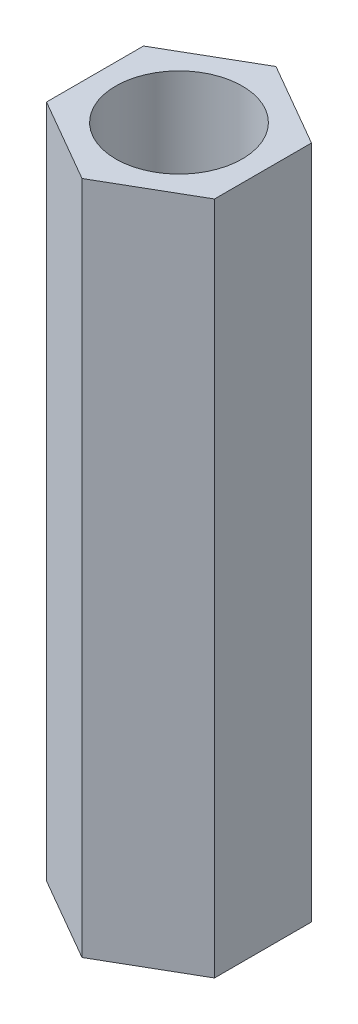
ISO-10303-21;
HEADER;
FILE_DESCRIPTION(('STEP AP214'),'2;1');
FILE_NAME('part.step','',(''),(''),'','','');
FILE_SCHEMA(('AUTOMOTIVE_DESIGN { 1 0 10303 214 1 1 1 1 }'));
ENDSEC;
DATA;
#1=APPLICATION_CONTEXT('core data for automotive mechanical design processes');
#2=APPLICATION_PROTOCOL_DEFINITION('international standard','automotive_design',2000,#1);
#3=PRODUCT_CONTEXT('',#1,'mechanical');
#4=PRODUCT('Part','Part','',(#3));
#5=PRODUCT_RELATED_PRODUCT_CATEGORY('part','',(#4));
#6=PRODUCT_DEFINITION_FORMATION('','',#4);
#7=PRODUCT_DEFINITION_CONTEXT('part definition',#1,'design');
#8=PRODUCT_DEFINITION('design','',#6,#7);
#9=PRODUCT_DEFINITION_SHAPE('','',#8);
#10=(LENGTH_UNIT() NAMED_UNIT(*) SI_UNIT(.MILLI.,.METRE.));
#11=(NAMED_UNIT(*) PLANE_ANGLE_UNIT() SI_UNIT($,.RADIAN.));
#12=(NAMED_UNIT(*) SI_UNIT($,.STERADIAN.) SOLID_ANGLE_UNIT());
#13=UNCERTAINTY_MEASURE_WITH_UNIT(LENGTH_MEASURE(1.E-05),#10,'distance_accuracy_value','');
#14=(GEOMETRIC_REPRESENTATION_CONTEXT(3) GLOBAL_UNCERTAINTY_ASSIGNED_CONTEXT((#13)) GLOBAL_UNIT_ASSIGNED_CONTEXT((#10,
#11,#12)) REPRESENTATION_CONTEXT('',''));
#15=CARTESIAN_POINT('',(0.,0.,0.));
#16=DIRECTION('',(0.,0.,1.));
#17=DIRECTION('',(1.,0.,0.));
#18=AXIS2_PLACEMENT_3D('',#15,#16,#17);
#19=CARTESIAN_POINT('',(0.,16.,0.));
#20=DIRECTION('',(0.,1.,0.));
#21=DIRECTION('',(0.,0.,1.));
#22=AXIS2_PLACEMENT_3D('',#19,#20,#21);
#23=PLANE('',#22);
#24=DIRECTION('',(0.,0.,-1.));
#25=VECTOR('',#24,1.);
#26=CARTESIAN_POINT('',(1.99185842870421,16.,1.14999999999999));
#27=LINE('',#26,#25);
#28=CARTESIAN_POINT('',(1.99185842870421,16.,1.14999999999999));
#29=VERTEX_POINT('',#28);
#30=CARTESIAN_POINT('',(1.9918584287042,16.,-1.15000000000001));
#31=VERTEX_POINT('',#30);
#32=EDGE_CURVE('E137',#29,#31,#27,.T.);
#33=ORIENTED_EDGE('',*,*,#32,.T.);
#34=DIRECTION('',(-0.866025403784441,0.,-0.499999999999995));
#35=VECTOR('',#34,1.);
#36=CARTESIAN_POINT('',(1.9918584287042,16.,-1.15000000000001));
#37=LINE('',#36,#35);
#38=CARTESIAN_POINT('',(0.,16.,-2.3));
#39=VERTEX_POINT('',#38);
#40=EDGE_CURVE('E95',#31,#39,#37,.T.);
#41=ORIENTED_EDGE('',*,*,#40,.T.);
#42=DIRECTION('',(-0.866025403784436,0.,0.500000000000004));
#43=VECTOR('',#42,1.);
#44=CARTESIAN_POINT('',(0.,16.,-2.3));
#45=LINE('',#44,#43);
#46=CARTESIAN_POINT('',(-1.99185842870422,16.,-1.14999999999999));
#47=VERTEX_POINT('',#46);
#48=EDGE_CURVE('E108',#39,#47,#45,.T.);
#49=ORIENTED_EDGE('',*,*,#48,.T.);
#50=DIRECTION('',(0.,0.,1.));
#51=VECTOR('',#50,1.);
#52=CARTESIAN_POINT('',(-1.99185842870422,16.,-1.14999999999999));
#53=LINE('',#52,#51);
#54=CARTESIAN_POINT('',(-1.9918584287042,16.,1.15000000000001));
#55=VERTEX_POINT('',#54);
#56=EDGE_CURVE('E102',#47,#55,#53,.T.);
#57=ORIENTED_EDGE('',*,*,#56,.T.);
#58=DIRECTION('',(0.866025403784441,0.,0.499999999999995));
#59=VECTOR('',#58,1.);
#60=CARTESIAN_POINT('',(-1.9918584287042,16.,1.15000000000001));
#61=LINE('',#60,#59);
#62=CARTESIAN_POINT('',(0.,16.,2.3));
#63=VERTEX_POINT('',#62);
#64=EDGE_CURVE('E106',#55,#63,#61,.T.);
#65=ORIENTED_EDGE('',*,*,#64,.T.);
#66=DIRECTION('',(0.866025403784436,0.,-0.500000000000004));
#67=VECTOR('',#66,1.);
#68=CARTESIAN_POINT('',(0.,16.,2.3));
#69=LINE('',#68,#67);
#70=EDGE_CURVE('E58',#63,#29,#69,.T.);
#71=ORIENTED_EDGE('',*,*,#70,.T.);
#72=EDGE_LOOP('',(#33,#41,#49,#57,#65,#71));
#73=FACE_BOUND('',#72,.T.);
#74=CARTESIAN_POINT('',(0.,16.,0.));
#75=DIRECTION('',(0.,1.,0.));
#76=DIRECTION('',(0.,0.,1.));
#77=AXIS2_PLACEMENT_3D('',#74,#75,#76);
#78=CIRCLE('',#77,1.5);
#79=CARTESIAN_POINT('',(0.,16.,1.5));
#80=VERTEX_POINT('',#79);
#81=EDGE_CURVE('E130',#80,#80,#78,.T.);
#82=ORIENTED_EDGE('',*,*,#81,.F.);
#83=EDGE_LOOP('',(#82));
#84=FACE_BOUND('',#83,.T.);
#85=ADVANCED_FACE('F41',(#73,#84),#23,.T.);
#86=CARTESIAN_POINT('',(0.,0.,0.));
#87=DIRECTION('',(0.,1.,0.));
#88=DIRECTION('',(0.,0.,1.));
#89=AXIS2_PLACEMENT_3D('',#86,#87,#88);
#90=PLANE('',#89);
#91=DIRECTION('',(0.,0.,-1.));
#92=VECTOR('',#91,1.);
#93=CARTESIAN_POINT('',(1.99185842870421,0.,1.14999999999999));
#94=LINE('',#93,#92);
#95=CARTESIAN_POINT('',(1.99185842870421,0.,1.14999999999999));
#96=VERTEX_POINT('',#95);
#97=CARTESIAN_POINT('',(1.9918584287042,0.,-1.15000000000001));
#98=VERTEX_POINT('',#97);
#99=EDGE_CURVE('E126',#96,#98,#94,.T.);
#100=ORIENTED_EDGE('',*,*,#99,.F.);
#101=DIRECTION('',(0.866025403784436,0.,-0.500000000000004));
#102=VECTOR('',#101,1.);
#103=CARTESIAN_POINT('',(0.,0.,2.3));
#104=LINE('',#103,#102);
#105=CARTESIAN_POINT('',(0.,0.,2.3));
#106=VERTEX_POINT('',#105);
#107=EDGE_CURVE('E87',#106,#96,#104,.T.);
#108=ORIENTED_EDGE('',*,*,#107,.F.);
#109=DIRECTION('',(0.866025403784441,0.,0.499999999999995));
#110=VECTOR('',#109,1.);
#111=CARTESIAN_POINT('',(-1.9918584287042,0.,1.15000000000001));
#112=LINE('',#111,#110);
#113=CARTESIAN_POINT('',(-1.9918584287042,0.,1.15000000000001));
#114=VERTEX_POINT('',#113);
#115=EDGE_CURVE('E81',#114,#106,#112,.T.);
#116=ORIENTED_EDGE('',*,*,#115,.F.);
#117=DIRECTION('',(0.,0.,1.));
#118=VECTOR('',#117,1.);
#119=CARTESIAN_POINT('',(-1.99185842870422,0.,-1.14999999999999));
#120=LINE('',#119,#118);
#121=CARTESIAN_POINT('',(-1.99185842870422,0.,-1.14999999999999));
#122=VERTEX_POINT('',#121);
#123=EDGE_CURVE('E116',#122,#114,#120,.T.);
#124=ORIENTED_EDGE('',*,*,#123,.F.);
#125=DIRECTION('',(-0.866025403784436,0.,0.500000000000004));
#126=VECTOR('',#125,1.);
#127=CARTESIAN_POINT('',(0.,0.,-2.3));
#128=LINE('',#127,#126);
#129=CARTESIAN_POINT('',(0.,0.,-2.3));
#130=VERTEX_POINT('',#129);
#131=EDGE_CURVE('E132',#130,#122,#128,.T.);
#132=ORIENTED_EDGE('',*,*,#131,.F.);
#133=DIRECTION('',(-0.866025403784441,0.,-0.499999999999995));
#134=VECTOR('',#133,1.);
#135=CARTESIAN_POINT('',(1.9918584287042,0.,-1.15000000000001));
#136=LINE('',#135,#134);
#137=EDGE_CURVE('E129',#98,#130,#136,.T.);
#138=ORIENTED_EDGE('',*,*,#137,.F.);
#139=EDGE_LOOP('',(#100,#108,#116,#124,#132,#138));
#140=FACE_BOUND('',#139,.T.);
#141=CARTESIAN_POINT('',(0.,0.,0.));
#142=DIRECTION('',(0.,1.,0.));
#143=DIRECTION('',(0.,0.,1.));
#144=AXIS2_PLACEMENT_3D('',#141,#142,#143);
#145=CIRCLE('',#144,1.5);
#146=CARTESIAN_POINT('',(0.,0.,1.5));
#147=VERTEX_POINT('',#146);
#148=EDGE_CURVE('E230',#147,#147,#145,.T.);
#149=ORIENTED_EDGE('',*,*,#148,.T.);
#150=EDGE_LOOP('',(#149));
#151=FACE_BOUND('',#150,.T.);
#152=ADVANCED_FACE('F146',(#140,#151),#90,.F.);
#153=CARTESIAN_POINT('',(1.99185842870421,16.,1.14999999999999));
#154=DIRECTION('',(-1.,0.,0.));
#155=DIRECTION('',(0.,0.,1.));
#156=AXIS2_PLACEMENT_3D('',#153,#154,#155);
#157=PLANE('',#156);
#158=ORIENTED_EDGE('',*,*,#99,.T.);
#159=DIRECTION('',(0.,-1.,0.));
#160=VECTOR('',#159,1.);
#161=CARTESIAN_POINT('',(1.9918584287042,16.,-1.15000000000001));
#162=LINE('',#161,#160);
#163=EDGE_CURVE('E11',#31,#98,#162,.T.);
#164=ORIENTED_EDGE('',*,*,#163,.F.);
#165=ORIENTED_EDGE('',*,*,#32,.F.);
#166=DIRECTION('',(0.,-1.,0.));
#167=VECTOR('',#166,1.);
#168=CARTESIAN_POINT('',(1.99185842870421,16.,1.14999999999999));
#169=LINE('',#168,#167);
#170=EDGE_CURVE('E122',#29,#96,#169,.T.);
#171=ORIENTED_EDGE('',*,*,#170,.T.);
#172=EDGE_LOOP('',(#158,#164,#165,#171));
#173=FACE_BOUND('',#172,.T.);
#174=ADVANCED_FACE('F43',(#173),#157,.F.);
#175=CARTESIAN_POINT('',(1.9918584287042,16.,-1.15000000000001));
#176=DIRECTION('',(-0.499999999999995,0.,0.866025403784441));
#177=DIRECTION('',(0.866025403784441,0.,0.499999999999995));
#178=AXIS2_PLACEMENT_3D('',#175,#176,#177);
#179=PLANE('',#178);
#180=ORIENTED_EDGE('',*,*,#137,.T.);
#181=DIRECTION('',(0.,-1.,0.));
#182=VECTOR('',#181,1.);
#183=CARTESIAN_POINT('',(0.,16.,-2.3));
#184=LINE('',#183,#182);
#185=EDGE_CURVE('E50',#39,#130,#184,.T.);
#186=ORIENTED_EDGE('',*,*,#185,.F.);
#187=ORIENTED_EDGE('',*,*,#40,.F.);
#188=ORIENTED_EDGE('',*,*,#163,.T.);
#189=EDGE_LOOP('',(#180,#186,#187,#188));
#190=FACE_BOUND('',#189,.T.);
#191=ADVANCED_FACE('F171',(#190),#179,.F.);
#192=CARTESIAN_POINT('',(0.,16.,-2.3));
#193=DIRECTION('',(0.500000000000004,0.,0.866025403784436));
#194=DIRECTION('',(0.866025403784436,0.,-0.500000000000004));
#195=AXIS2_PLACEMENT_3D('',#192,#193,#194);
#196=PLANE('',#195);
#197=ORIENTED_EDGE('',*,*,#131,.T.);
#198=DIRECTION('',(0.,-1.,0.));
#199=VECTOR('',#198,1.);
#200=CARTESIAN_POINT('',(-1.99185842870422,16.,-1.14999999999999));
#201=LINE('',#200,#199);
#202=EDGE_CURVE('E117',#47,#122,#201,.T.);
#203=ORIENTED_EDGE('',*,*,#202,.F.);
#204=ORIENTED_EDGE('',*,*,#48,.F.);
#205=ORIENTED_EDGE('',*,*,#185,.T.);
#206=EDGE_LOOP('',(#197,#203,#204,#205));
#207=FACE_BOUND('',#206,.T.);
#208=ADVANCED_FACE('F143',(#207),#196,.F.);
#209=CARTESIAN_POINT('',(-1.99185842870422,16.,-1.14999999999999));
#210=DIRECTION('',(1.,0.,0.));
#211=DIRECTION('',(0.,0.,-1.));
#212=AXIS2_PLACEMENT_3D('',#209,#210,#211);
#213=PLANE('',#212);
#214=ORIENTED_EDGE('',*,*,#123,.T.);
#215=DIRECTION('',(0.,-1.,0.));
#216=VECTOR('',#215,1.);
#217=CARTESIAN_POINT('',(-1.9918584287042,16.,1.15000000000001));
#218=LINE('',#217,#216);
#219=EDGE_CURVE('E113',#55,#114,#218,.T.);
#220=ORIENTED_EDGE('',*,*,#219,.F.);
#221=ORIENTED_EDGE('',*,*,#56,.F.);
#222=ORIENTED_EDGE('',*,*,#202,.T.);
#223=EDGE_LOOP('',(#214,#220,#221,#222));
#224=FACE_BOUND('',#223,.T.);
#225=ADVANCED_FACE('F114',(#224),#213,.F.);
#226=CARTESIAN_POINT('',(-1.9918584287042,16.,1.15000000000001));
#227=DIRECTION('',(0.499999999999995,0.,-0.866025403784441));
#228=DIRECTION('',(-0.866025403784441,0.,-0.499999999999995));
#229=AXIS2_PLACEMENT_3D('',#226,#227,#228);
#230=PLANE('',#229);
#231=ORIENTED_EDGE('',*,*,#115,.T.);
#232=DIRECTION('',(0.,-1.,0.));
#233=VECTOR('',#232,1.);
#234=CARTESIAN_POINT('',(0.,16.,2.3));
#235=LINE('',#234,#233);
#236=EDGE_CURVE('E118',#63,#106,#235,.T.);
#237=ORIENTED_EDGE('',*,*,#236,.F.);
#238=ORIENTED_EDGE('',*,*,#64,.F.);
#239=ORIENTED_EDGE('',*,*,#219,.T.);
#240=EDGE_LOOP('',(#231,#237,#238,#239));
#241=FACE_BOUND('',#240,.T.);
#242=ADVANCED_FACE('F120',(#241),#230,.F.);
#243=CARTESIAN_POINT('',(0.,16.,2.3));
#244=DIRECTION('',(-0.500000000000004,0.,-0.866025403784436));
#245=DIRECTION('',(-0.866025403784437,0.,0.500000000000004));
#246=AXIS2_PLACEMENT_3D('',#243,#244,#245);
#247=PLANE('',#246);
#248=ORIENTED_EDGE('',*,*,#107,.T.);
#249=ORIENTED_EDGE('',*,*,#170,.F.);
#250=ORIENTED_EDGE('',*,*,#70,.F.);
#251=ORIENTED_EDGE('',*,*,#236,.T.);
#252=EDGE_LOOP('',(#248,#249,#250,#251));
#253=FACE_BOUND('',#252,.T.);
#254=ADVANCED_FACE('F151',(#253),#247,.F.);
#255=CARTESIAN_POINT('',(0.,16.,0.));
#256=DIRECTION('',(0.,-1.,0.));
#257=DIRECTION('',(0.,0.,-1.));
#258=AXIS2_PLACEMENT_3D('',#255,#256,#257);
#259=CYLINDRICAL_SURFACE('',#258,1.5);
#260=ORIENTED_EDGE('',*,*,#81,.T.);
#261=EDGE_LOOP('',(#260));
#262=FACE_BOUND('',#261,.T.);
#263=ORIENTED_EDGE('',*,*,#148,.F.);
#264=EDGE_LOOP('',(#263));
#265=FACE_BOUND('',#264,.T.);
#266=ADVANCED_FACE('F153',(#262,#265),#259,.F.);
#267=CLOSED_SHELL('',(#85,#152,#174,#191,#208,#225,#242,#254,#266));
#268=MANIFOLD_SOLID_BREP('B2',#267);
#269=ADVANCED_BREP_SHAPE_REPRESENTATION('',(#18,#268),#14);
#270=SHAPE_DEFINITION_REPRESENTATION(#9,#269);
ENDSEC;
END-ISO-10303-21;
